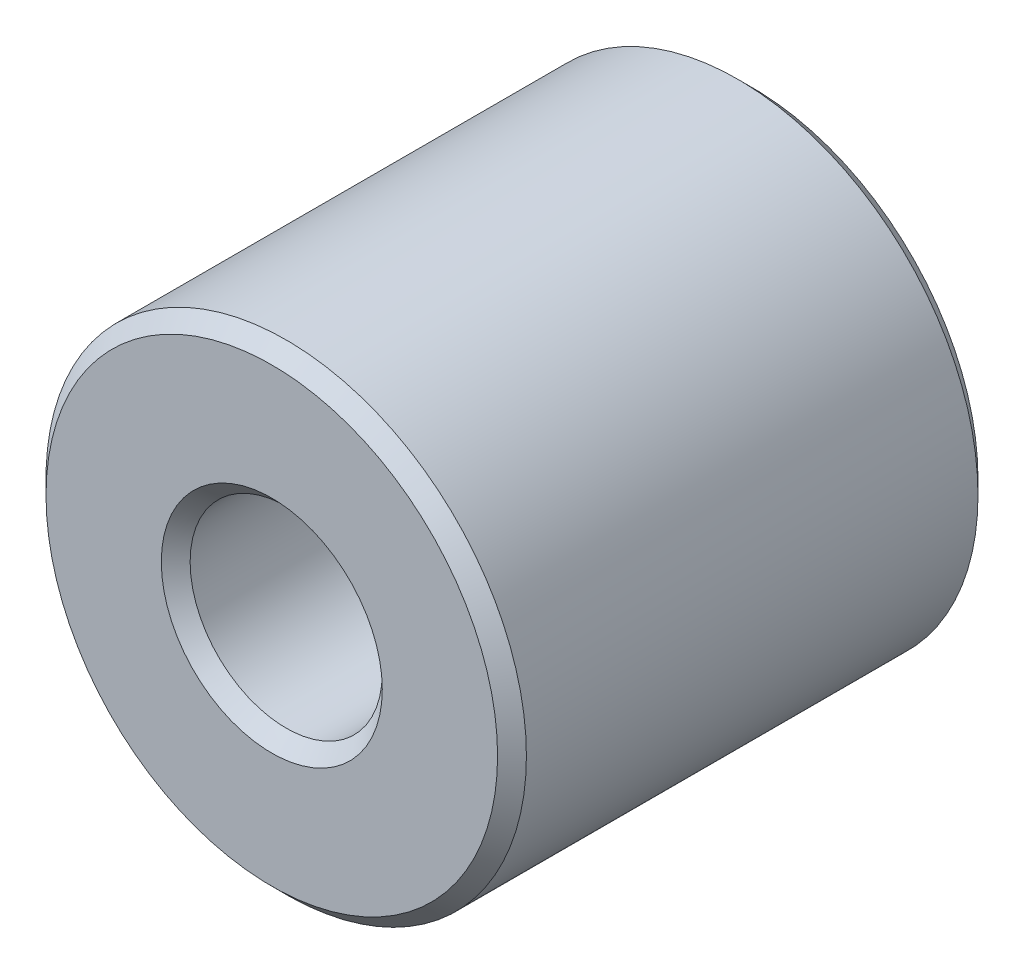
ISO-10303-21;
HEADER;
FILE_DESCRIPTION(('STEP AP214'),'2;1');
FILE_NAME('part.step','',(''),(''),'','','');
FILE_SCHEMA(('AUTOMOTIVE_DESIGN { 1 0 10303 214 1 1 1 1 }'));
ENDSEC;
DATA;
#1=APPLICATION_CONTEXT('core data for automotive mechanical design processes');
#2=APPLICATION_PROTOCOL_DEFINITION('international standard','automotive_design',2000,#1);
#3=PRODUCT_CONTEXT('',#1,'mechanical');
#4=PRODUCT('Part','Part','',(#3));
#5=PRODUCT_RELATED_PRODUCT_CATEGORY('part','',(#4));
#6=PRODUCT_DEFINITION_FORMATION('','',#4);
#7=PRODUCT_DEFINITION_CONTEXT('part definition',#1,'design');
#8=PRODUCT_DEFINITION('design','',#6,#7);
#9=PRODUCT_DEFINITION_SHAPE('','',#8);
#10=(LENGTH_UNIT() NAMED_UNIT(*) SI_UNIT(.MILLI.,.METRE.));
#11=(NAMED_UNIT(*) PLANE_ANGLE_UNIT() SI_UNIT($,.RADIAN.));
#12=(NAMED_UNIT(*) SI_UNIT($,.STERADIAN.) SOLID_ANGLE_UNIT());
#13=UNCERTAINTY_MEASURE_WITH_UNIT(LENGTH_MEASURE(1.E-05),#10,'distance_accuracy_value','');
#14=(GEOMETRIC_REPRESENTATION_CONTEXT(3) GLOBAL_UNCERTAINTY_ASSIGNED_CONTEXT((#13)) GLOBAL_UNIT_ASSIGNED_CONTEXT((#10,
#11,#12)) REPRESENTATION_CONTEXT('',''));
#15=CARTESIAN_POINT('',(0.,0.,0.));
#16=DIRECTION('',(0.,0.,1.));
#17=DIRECTION('',(1.,0.,0.));
#18=AXIS2_PLACEMENT_3D('',#15,#16,#17);
#19=CARTESIAN_POINT('',(0.,0.,-4.));
#20=DIRECTION('',(0.,0.,1.));
#21=DIRECTION('',(1.,0.,0.));
#22=AXIS2_PLACEMENT_3D('',#19,#20,#21);
#23=CYLINDRICAL_SURFACE('',#22,4.);
#24=CARTESIAN_POINT('',(0.,0.,3.76));
#25=DIRECTION('',(0.,0.,1.));
#26=DIRECTION('',(1.,0.,0.));
#27=AXIS2_PLACEMENT_3D('',#24,#25,#26);
#28=CIRCLE('',#27,4.);
#29=CARTESIAN_POINT('',(4.,0.,3.76));
#30=VERTEX_POINT('',#29);
#31=EDGE_CURVE('E63',#30,#30,#28,.F.);
#32=ORIENTED_EDGE('',*,*,#31,.T.);
#33=EDGE_LOOP('',(#32));
#34=FACE_BOUND('',#33,.T.);
#35=CARTESIAN_POINT('',(0.,0.,-3.76));
#36=DIRECTION('',(0.,0.,1.));
#37=DIRECTION('',(1.,0.,0.));
#38=AXIS2_PLACEMENT_3D('',#35,#36,#37);
#39=CIRCLE('',#38,4.);
#40=CARTESIAN_POINT('',(4.,0.,-3.76));
#41=VERTEX_POINT('',#40);
#42=EDGE_CURVE('E67',#41,#41,#39,.T.);
#43=ORIENTED_EDGE('',*,*,#42,.T.);
#44=EDGE_LOOP('',(#43));
#45=FACE_BOUND('',#44,.T.);
#46=ADVANCED_FACE('F39',(#34,#45),#23,.T.);
#47=CARTESIAN_POINT('',(0.,0.,-4.));
#48=DIRECTION('',(0.,0.,1.));
#49=DIRECTION('',(1.,0.,0.));
#50=AXIS2_PLACEMENT_3D('',#47,#48,#49);
#51=PLANE('',#50);
#52=CARTESIAN_POINT('',(0.,0.,-4.));
#53=DIRECTION('',(0.,0.,1.));
#54=DIRECTION('',(1.,0.,0.));
#55=AXIS2_PLACEMENT_3D('',#52,#53,#54);
#56=CIRCLE('',#55,3.76);
#57=CARTESIAN_POINT('',(3.76,0.,-4.));
#58=VERTEX_POINT('',#57);
#59=EDGE_CURVE('E53',#58,#58,#56,.F.);
#60=ORIENTED_EDGE('',*,*,#59,.T.);
#61=EDGE_LOOP('',(#60));
#62=FACE_BOUND('',#61,.T.);
#63=CARTESIAN_POINT('',(0.,0.,-4.));
#64=DIRECTION('',(0.,0.,1.));
#65=DIRECTION('',(1.,0.,0.));
#66=AXIS2_PLACEMENT_3D('',#63,#64,#65);
#67=CIRCLE('',#66,1.84);
#68=CARTESIAN_POINT('',(1.84,0.,-4.));
#69=VERTEX_POINT('',#68);
#70=EDGE_CURVE('E58',#69,#69,#67,.T.);
#71=ORIENTED_EDGE('',*,*,#70,.T.);
#72=EDGE_LOOP('',(#71));
#73=FACE_BOUND('',#72,.T.);
#74=ADVANCED_FACE('F93',(#62,#73),#51,.F.);
#75=CARTESIAN_POINT('',(0.,0.,-4.));
#76=DIRECTION('',(0.,0.,1.));
#77=DIRECTION('',(1.,0.,0.));
#78=AXIS2_PLACEMENT_3D('',#75,#76,#77);
#79=CYLINDRICAL_SURFACE('',#78,1.6);
#80=CARTESIAN_POINT('',(0.,0.,3.76));
#81=DIRECTION('',(0.,0.,1.));
#82=DIRECTION('',(1.,0.,0.));
#83=AXIS2_PLACEMENT_3D('',#80,#81,#82);
#84=CIRCLE('',#83,1.6);
#85=CARTESIAN_POINT('',(1.6,0.,3.76));
#86=VERTEX_POINT('',#85);
#87=EDGE_CURVE('E10',#86,#86,#84,.T.);
#88=ORIENTED_EDGE('',*,*,#87,.T.);
#89=EDGE_LOOP('',(#88));
#90=FACE_BOUND('',#89,.T.);
#91=CARTESIAN_POINT('',(0.,0.,-3.76));
#92=DIRECTION('',(0.,0.,1.));
#93=DIRECTION('',(1.,0.,0.));
#94=AXIS2_PLACEMENT_3D('',#91,#92,#93);
#95=CIRCLE('',#94,1.6);
#96=CARTESIAN_POINT('',(1.6,0.,-3.76));
#97=VERTEX_POINT('',#96);
#98=EDGE_CURVE('E47',#97,#97,#95,.F.);
#99=ORIENTED_EDGE('',*,*,#98,.T.);
#100=EDGE_LOOP('',(#99));
#101=FACE_BOUND('',#100,.T.);
#102=ADVANCED_FACE('F99',(#90,#101),#79,.F.);
#103=CARTESIAN_POINT('',(0.,0.,4.));
#104=DIRECTION('',(0.,0.,1.));
#105=DIRECTION('',(1.,0.,0.));
#106=AXIS2_PLACEMENT_3D('',#103,#104,#105);
#107=PLANE('',#106);
#108=CARTESIAN_POINT('',(0.,0.,4.));
#109=DIRECTION('',(0.,0.,1.));
#110=DIRECTION('',(1.,0.,0.));
#111=AXIS2_PLACEMENT_3D('',#108,#109,#110);
#112=CIRCLE('',#111,3.76);
#113=CARTESIAN_POINT('',(3.76,0.,4.));
#114=VERTEX_POINT('',#113);
#115=EDGE_CURVE('E71',#114,#114,#112,.T.);
#116=ORIENTED_EDGE('',*,*,#115,.T.);
#117=EDGE_LOOP('',(#116));
#118=FACE_BOUND('',#117,.T.);
#119=CARTESIAN_POINT('',(0.,0.,4.));
#120=DIRECTION('',(0.,0.,1.));
#121=DIRECTION('',(1.,0.,0.));
#122=AXIS2_PLACEMENT_3D('',#119,#120,#121);
#123=CIRCLE('',#122,1.84);
#124=CARTESIAN_POINT('',(1.84,0.,4.));
#125=VERTEX_POINT('',#124);
#126=EDGE_CURVE('E74',#125,#125,#123,.F.);
#127=ORIENTED_EDGE('',*,*,#126,.T.);
#128=EDGE_LOOP('',(#127));
#129=FACE_BOUND('',#128,.T.);
#130=ADVANCED_FACE('F78',(#118,#129),#107,.T.);
#131=CARTESIAN_POINT('',(0.,0.,4.));
#132=DIRECTION('',(0.,0.,-1.));
#133=DIRECTION('',(-1.,0.,0.));
#134=AXIS2_PLACEMENT_3D('',#131,#132,#133);
#135=CONICAL_SURFACE('',#134,3.76,0.785398163397447);
#136=ORIENTED_EDGE('',*,*,#31,.F.);
#137=EDGE_LOOP('',(#136));
#138=FACE_BOUND('',#137,.T.);
#139=ORIENTED_EDGE('',*,*,#115,.F.);
#140=EDGE_LOOP('',(#139));
#141=FACE_BOUND('',#140,.T.);
#142=ADVANCED_FACE('F89',(#138,#141),#135,.T.);
#143=CARTESIAN_POINT('',(0.,0.,-3.76));
#144=DIRECTION('',(0.,0.,1.));
#145=DIRECTION('',(1.,0.,0.));
#146=AXIS2_PLACEMENT_3D('',#143,#144,#145);
#147=CONICAL_SURFACE('',#146,4.,0.78539816339745);
#148=ORIENTED_EDGE('',*,*,#59,.F.);
#149=EDGE_LOOP('',(#148));
#150=FACE_BOUND('',#149,.T.);
#151=ORIENTED_EDGE('',*,*,#42,.F.);
#152=EDGE_LOOP('',(#151));
#153=FACE_BOUND('',#152,.T.);
#154=ADVANCED_FACE('F83',(#150,#153),#147,.T.);
#155=CARTESIAN_POINT('',(0.,0.,3.76));
#156=DIRECTION('',(0.,0.,1.));
#157=DIRECTION('',(1.,0.,0.));
#158=AXIS2_PLACEMENT_3D('',#155,#156,#157);
#159=CONICAL_SURFACE('',#158,1.6,0.78539816339745);
#160=ORIENTED_EDGE('',*,*,#126,.F.);
#161=EDGE_LOOP('',(#160));
#162=FACE_BOUND('',#161,.T.);
#163=ORIENTED_EDGE('',*,*,#87,.F.);
#164=EDGE_LOOP('',(#163));
#165=FACE_BOUND('',#164,.T.);
#166=ADVANCED_FACE('F80',(#162,#165),#159,.F.);
#167=CARTESIAN_POINT('',(0.,0.,-4.));
#168=DIRECTION('',(0.,0.,-1.));
#169=DIRECTION('',(-1.,0.,0.));
#170=AXIS2_PLACEMENT_3D('',#167,#168,#169);
#171=CONICAL_SURFACE('',#170,1.84,0.785398163397446);
#172=ORIENTED_EDGE('',*,*,#98,.F.);
#173=EDGE_LOOP('',(#172));
#174=FACE_BOUND('',#173,.T.);
#175=ORIENTED_EDGE('',*,*,#70,.F.);
#176=EDGE_LOOP('',(#175));
#177=FACE_BOUND('',#176,.T.);
#178=ADVANCED_FACE('F41',(#174,#177),#171,.F.);
#179=CLOSED_SHELL('',(#46,#74,#102,#130,#142,#154,#166,#178));
#180=MANIFOLD_SOLID_BREP('B2',#179);
#181=ADVANCED_BREP_SHAPE_REPRESENTATION('',(#18,#180),#14);
#182=SHAPE_DEFINITION_REPRESENTATION(#9,#181);
ENDSEC;
END-ISO-10303-21;
